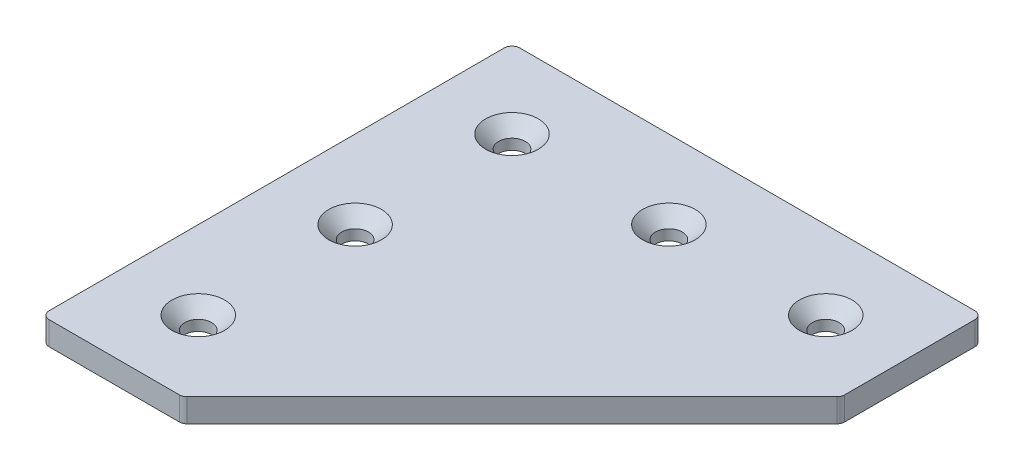
ISO-10303-21;
HEADER;
FILE_DESCRIPTION(('STEP AP214'),'2;1');
FILE_NAME('part.step','',(''),(''),'','','');
FILE_SCHEMA(('AUTOMOTIVE_DESIGN { 1 0 10303 214 1 1 1 1 }'));
ENDSEC;
DATA;
#1=APPLICATION_CONTEXT('core data for automotive mechanical design processes');
#2=APPLICATION_PROTOCOL_DEFINITION('international standard','automotive_design',2000,#1);
#3=PRODUCT_CONTEXT('',#1,'mechanical');
#4=PRODUCT('Part','Part','',(#3));
#5=PRODUCT_RELATED_PRODUCT_CATEGORY('part','',(#4));
#6=PRODUCT_DEFINITION_FORMATION('','',#4);
#7=PRODUCT_DEFINITION_CONTEXT('part definition',#1,'design');
#8=PRODUCT_DEFINITION('design','',#6,#7);
#9=PRODUCT_DEFINITION_SHAPE('','',#8);
#10=(LENGTH_UNIT() NAMED_UNIT(*) SI_UNIT(.MILLI.,.METRE.));
#11=(NAMED_UNIT(*) PLANE_ANGLE_UNIT() SI_UNIT($,.RADIAN.));
#12=(NAMED_UNIT(*) SI_UNIT($,.STERADIAN.) SOLID_ANGLE_UNIT());
#13=UNCERTAINTY_MEASURE_WITH_UNIT(LENGTH_MEASURE(1.E-05),#10,'distance_accuracy_value','');
#14=(GEOMETRIC_REPRESENTATION_CONTEXT(3) GLOBAL_UNCERTAINTY_ASSIGNED_CONTEXT((#13)) GLOBAL_UNIT_ASSIGNED_CONTEXT((#10,
#11,#12)) REPRESENTATION_CONTEXT('',''));
#15=CARTESIAN_POINT('',(0.,0.,0.));
#16=DIRECTION('',(0.,0.,1.));
#17=DIRECTION('',(1.,0.,0.));
#18=AXIS2_PLACEMENT_3D('',#15,#16,#17);
#19=CARTESIAN_POINT('',(30.,3.,30.));
#20=DIRECTION('',(-1.,0.,0.));
#21=DIRECTION('',(0.,0.,1.));
#22=AXIS2_PLACEMENT_3D('',#19,#20,#21);
#23=PLANE('',#22);
#24=DIRECTION('',(0.,0.,-1.));
#25=VECTOR('',#24,1.);
#26=CARTESIAN_POINT('',(30.,0.,30.));
#27=LINE('',#26,#25);
#28=CARTESIAN_POINT('',(30.,0.,-12.4142135623731));
#29=VERTEX_POINT('',#28);
#30=CARTESIAN_POINT('',(30.,0.,-29.));
#31=VERTEX_POINT('',#30);
#32=EDGE_CURVE('E143',#29,#31,#27,.T.);
#33=ORIENTED_EDGE('',*,*,#32,.T.);
#34=DIRECTION('',(0.,-1.,0.));
#35=VECTOR('',#34,1.);
#36=CARTESIAN_POINT('',(30.,3.,-29.));
#37=LINE('',#36,#35);
#38=CARTESIAN_POINT('',(30.,3.,-29.));
#39=VERTEX_POINT('',#38);
#40=EDGE_CURVE('E48',#31,#39,#37,.F.);
#41=ORIENTED_EDGE('',*,*,#40,.T.);
#42=DIRECTION('',(0.,0.,-1.));
#43=VECTOR('',#42,1.);
#44=CARTESIAN_POINT('',(30.,3.,30.));
#45=LINE('',#44,#43);
#46=CARTESIAN_POINT('',(30.,3.,-12.4142135623731));
#47=VERTEX_POINT('',#46);
#48=EDGE_CURVE('E141',#47,#39,#45,.T.);
#49=ORIENTED_EDGE('',*,*,#48,.F.);
#50=DIRECTION('',(0.,1.,0.));
#51=VECTOR('',#50,1.);
#52=CARTESIAN_POINT('',(30.,3.,-12.4142135623731));
#53=LINE('',#52,#51);
#54=EDGE_CURVE('E170',#47,#29,#53,.F.);
#55=ORIENTED_EDGE('',*,*,#54,.T.);
#56=EDGE_LOOP('',(#33,#41,#49,#55));
#57=FACE_BOUND('',#56,.T.);
#58=ADVANCED_FACE('F33',(#57),#23,.F.);
#59=CARTESIAN_POINT('',(-30.,3.,-30.));
#60=DIRECTION('',(0.,0.,1.));
#61=DIRECTION('',(1.,0.,0.));
#62=AXIS2_PLACEMENT_3D('',#59,#60,#61);
#63=PLANE('',#62);
#64=DIRECTION('',(-1.,0.,0.));
#65=VECTOR('',#64,1.);
#66=CARTESIAN_POINT('',(-30.,0.,-30.));
#67=LINE('',#66,#65);
#68=CARTESIAN_POINT('',(29.,0.,-30.));
#69=VERTEX_POINT('',#68);
#70=CARTESIAN_POINT('',(-29.,0.,-30.));
#71=VERTEX_POINT('',#70);
#72=EDGE_CURVE('E138',#69,#71,#67,.T.);
#73=ORIENTED_EDGE('',*,*,#72,.T.);
#74=DIRECTION('',(0.,-1.,0.));
#75=VECTOR('',#74,1.);
#76=CARTESIAN_POINT('',(-29.,3.,-30.));
#77=LINE('',#76,#75);
#78=CARTESIAN_POINT('',(-29.,3.,-30.));
#79=VERTEX_POINT('',#78);
#80=EDGE_CURVE('E116',#71,#79,#77,.F.);
#81=ORIENTED_EDGE('',*,*,#80,.T.);
#82=DIRECTION('',(-1.,0.,0.));
#83=VECTOR('',#82,1.);
#84=CARTESIAN_POINT('',(-30.,3.,-30.));
#85=LINE('',#84,#83);
#86=CARTESIAN_POINT('',(29.,3.,-30.));
#87=VERTEX_POINT('',#86);
#88=EDGE_CURVE('E195',#87,#79,#85,.T.);
#89=ORIENTED_EDGE('',*,*,#88,.F.);
#90=DIRECTION('',(0.,-1.,0.));
#91=VECTOR('',#90,1.);
#92=CARTESIAN_POINT('',(29.,3.,-30.));
#93=LINE('',#92,#91);
#94=EDGE_CURVE('E121',#87,#69,#93,.T.);
#95=ORIENTED_EDGE('',*,*,#94,.T.);
#96=EDGE_LOOP('',(#73,#81,#89,#95));
#97=FACE_BOUND('',#96,.T.);
#98=ADVANCED_FACE('F212',(#97),#63,.F.);
#99=CARTESIAN_POINT('',(-30.,3.,30.));
#100=DIRECTION('',(1.,0.,0.));
#101=DIRECTION('',(0.,0.,-1.));
#102=AXIS2_PLACEMENT_3D('',#99,#100,#101);
#103=PLANE('',#102);
#104=DIRECTION('',(0.,0.,1.));
#105=VECTOR('',#104,1.);
#106=CARTESIAN_POINT('',(-30.,3.,30.));
#107=LINE('',#106,#105);
#108=CARTESIAN_POINT('',(-30.,3.,-29.));
#109=VERTEX_POINT('',#108);
#110=CARTESIAN_POINT('',(-30.,3.,29.));
#111=VERTEX_POINT('',#110);
#112=EDGE_CURVE('E131',#109,#111,#107,.T.);
#113=ORIENTED_EDGE('',*,*,#112,.F.);
#114=DIRECTION('',(0.,-1.,0.));
#115=VECTOR('',#114,1.);
#116=CARTESIAN_POINT('',(-30.,3.,-29.));
#117=LINE('',#116,#115);
#118=CARTESIAN_POINT('',(-30.,0.,-29.));
#119=VERTEX_POINT('',#118);
#120=EDGE_CURVE('E115',#109,#119,#117,.T.);
#121=ORIENTED_EDGE('',*,*,#120,.T.);
#122=DIRECTION('',(0.,0.,1.));
#123=VECTOR('',#122,1.);
#124=CARTESIAN_POINT('',(-30.,0.,30.));
#125=LINE('',#124,#123);
#126=CARTESIAN_POINT('',(-30.,0.,29.));
#127=VERTEX_POINT('',#126);
#128=EDGE_CURVE('E128',#119,#127,#125,.T.);
#129=ORIENTED_EDGE('',*,*,#128,.T.);
#130=DIRECTION('',(0.,-1.,0.));
#131=VECTOR('',#130,1.);
#132=CARTESIAN_POINT('',(-30.,3.,29.));
#133=LINE('',#132,#131);
#134=EDGE_CURVE('E133',#127,#111,#133,.F.);
#135=ORIENTED_EDGE('',*,*,#134,.T.);
#136=EDGE_LOOP('',(#113,#121,#129,#135));
#137=FACE_BOUND('',#136,.T.);
#138=ADVANCED_FACE('F127',(#137),#103,.F.);
#139=CARTESIAN_POINT('',(-30.,3.,30.));
#140=DIRECTION('',(0.,0.,-1.));
#141=DIRECTION('',(-1.,0.,0.));
#142=AXIS2_PLACEMENT_3D('',#139,#140,#141);
#143=PLANE('',#142);
#144=DIRECTION('',(1.,0.,0.));
#145=VECTOR('',#144,1.);
#146=CARTESIAN_POINT('',(-30.,0.,30.));
#147=LINE('',#146,#145);
#148=CARTESIAN_POINT('',(-29.,0.,30.));
#149=VERTEX_POINT('',#148);
#150=CARTESIAN_POINT('',(-12.4142135623731,0.,30.));
#151=VERTEX_POINT('',#150);
#152=EDGE_CURVE('E137',#149,#151,#147,.T.);
#153=ORIENTED_EDGE('',*,*,#152,.T.);
#154=DIRECTION('',(0.,1.,0.));
#155=VECTOR('',#154,1.);
#156=CARTESIAN_POINT('',(-12.4142135623731,3.,30.));
#157=LINE('',#156,#155);
#158=CARTESIAN_POINT('',(-12.4142135623731,3.,30.));
#159=VERTEX_POINT('',#158);
#160=EDGE_CURVE('E11',#151,#159,#157,.T.);
#161=ORIENTED_EDGE('',*,*,#160,.T.);
#162=DIRECTION('',(1.,0.,0.));
#163=VECTOR('',#162,1.);
#164=CARTESIAN_POINT('',(-30.,3.,30.));
#165=LINE('',#164,#163);
#166=CARTESIAN_POINT('',(-29.,3.,30.));
#167=VERTEX_POINT('',#166);
#168=EDGE_CURVE('E150',#167,#159,#165,.T.);
#169=ORIENTED_EDGE('',*,*,#168,.F.);
#170=DIRECTION('',(0.,-1.,0.));
#171=VECTOR('',#170,1.);
#172=CARTESIAN_POINT('',(-29.,3.,30.));
#173=LINE('',#172,#171);
#174=EDGE_CURVE('E41',#167,#149,#173,.T.);
#175=ORIENTED_EDGE('',*,*,#174,.T.);
#176=EDGE_LOOP('',(#153,#161,#169,#175));
#177=FACE_BOUND('',#176,.T.);
#178=ADVANCED_FACE('F181',(#177),#143,.F.);
#179=CARTESIAN_POINT('',(0.,3.,0.));
#180=DIRECTION('',(0.,-1.,0.));
#181=DIRECTION('',(0.,0.,-1.));
#182=AXIS2_PLACEMENT_3D('',#179,#180,#181);
#183=PLANE('',#182);
#184=CARTESIAN_POINT('',(-20.,3.,-20.));
#185=DIRECTION('',(0.,1.,0.));
#186=DIRECTION('',(0.,0.,1.));
#187=AXIS2_PLACEMENT_3D('',#184,#185,#186);
#188=CIRCLE('',#187,3.36);
#189=CARTESIAN_POINT('',(-20.,3.,-16.64));
#190=VERTEX_POINT('',#189);
#191=EDGE_CURVE('E400',#190,#190,#188,.T.);
#192=ORIENTED_EDGE('',*,*,#191,.F.);
#193=EDGE_LOOP('',(#192));
#194=FACE_BOUND('',#193,.T.);
#195=CARTESIAN_POINT('',(0.,3.,-20.));
#196=DIRECTION('',(0.,1.,0.));
#197=DIRECTION('',(0.,0.,1.));
#198=AXIS2_PLACEMENT_3D('',#195,#196,#197);
#199=CIRCLE('',#198,3.36);
#200=CARTESIAN_POINT('',(0.,3.,-16.64));
#201=VERTEX_POINT('',#200);
#202=EDGE_CURVE('E404',#201,#201,#199,.T.);
#203=ORIENTED_EDGE('',*,*,#202,.F.);
#204=EDGE_LOOP('',(#203));
#205=FACE_BOUND('',#204,.T.);
#206=CARTESIAN_POINT('',(20.,3.,-20.));
#207=DIRECTION('',(0.,1.,0.));
#208=DIRECTION('',(0.,0.,1.));
#209=AXIS2_PLACEMENT_3D('',#206,#207,#208);
#210=CIRCLE('',#209,3.36);
#211=CARTESIAN_POINT('',(20.,3.,-16.64));
#212=VERTEX_POINT('',#211);
#213=EDGE_CURVE('E408',#212,#212,#210,.T.);
#214=ORIENTED_EDGE('',*,*,#213,.F.);
#215=EDGE_LOOP('',(#214));
#216=FACE_BOUND('',#215,.T.);
#217=CARTESIAN_POINT('',(-20.,3.,0.));
#218=DIRECTION('',(0.,1.,0.));
#219=DIRECTION('',(0.,0.,1.));
#220=AXIS2_PLACEMENT_3D('',#217,#218,#219);
#221=CIRCLE('',#220,3.36);
#222=CARTESIAN_POINT('',(-20.,3.,3.36));
#223=VERTEX_POINT('',#222);
#224=EDGE_CURVE('E412',#223,#223,#221,.T.);
#225=ORIENTED_EDGE('',*,*,#224,.F.);
#226=EDGE_LOOP('',(#225));
#227=FACE_BOUND('',#226,.T.);
#228=CARTESIAN_POINT('',(-20.,3.,20.));
#229=DIRECTION('',(0.,1.,0.));
#230=DIRECTION('',(0.,0.,1.));
#231=AXIS2_PLACEMENT_3D('',#228,#229,#230);
#232=CIRCLE('',#231,3.36);
#233=CARTESIAN_POINT('',(-20.,3.,23.36));
#234=VERTEX_POINT('',#233);
#235=EDGE_CURVE('E415',#234,#234,#232,.T.);
#236=ORIENTED_EDGE('',*,*,#235,.F.);
#237=EDGE_LOOP('',(#236));
#238=FACE_BOUND('',#237,.T.);
#239=ORIENTED_EDGE('',*,*,#88,.T.);
#240=CARTESIAN_POINT('',(-29.,3.,-29.));
#241=DIRECTION('',(0.,-1.,0.));
#242=DIRECTION('',(0.,0.,-1.));
#243=AXIS2_PLACEMENT_3D('',#240,#241,#242);
#244=CIRCLE('',#243,1.);
#245=EDGE_CURVE('E168',#79,#109,#244,.F.);
#246=ORIENTED_EDGE('',*,*,#245,.T.);
#247=ORIENTED_EDGE('',*,*,#112,.T.);
#248=CARTESIAN_POINT('',(-29.,3.,29.));
#249=DIRECTION('',(0.,-1.,0.));
#250=DIRECTION('',(0.,0.,-1.));
#251=AXIS2_PLACEMENT_3D('',#248,#249,#250);
#252=CIRCLE('',#251,1.);
#253=EDGE_CURVE('E161',#111,#167,#252,.F.);
#254=ORIENTED_EDGE('',*,*,#253,.T.);
#255=ORIENTED_EDGE('',*,*,#168,.T.);
#256=CARTESIAN_POINT('',(-12.4142135623731,3.,29.));
#257=DIRECTION('',(0.,-1.,0.));
#258=DIRECTION('',(0.,0.,-1.));
#259=AXIS2_PLACEMENT_3D('',#256,#257,#258);
#260=CIRCLE('',#259,1.);
#261=CARTESIAN_POINT('',(-11.7071067811865,3.,29.7071067811865));
#262=VERTEX_POINT('',#261);
#263=EDGE_CURVE('E163',#159,#262,#260,.F.);
#264=ORIENTED_EDGE('',*,*,#263,.T.);
#265=DIRECTION('',(-0.707106781186547,0.,0.707106781186547));
#266=VECTOR('',#265,1.);
#267=CARTESIAN_POINT('',(30.,3.,-12.));
#268=LINE('',#267,#266);
#269=CARTESIAN_POINT('',(29.7071067811865,3.,-11.7071067811865));
#270=VERTEX_POINT('',#269);
#271=EDGE_CURVE('E198',#270,#262,#268,.T.);
#272=ORIENTED_EDGE('',*,*,#271,.F.);
#273=CARTESIAN_POINT('',(29.,3.,-12.4142135623731));
#274=DIRECTION('',(0.,-1.,0.));
#275=DIRECTION('',(0.,0.,-1.));
#276=AXIS2_PLACEMENT_3D('',#273,#274,#275);
#277=CIRCLE('',#276,1.);
#278=EDGE_CURVE('E55',#270,#47,#277,.F.);
#279=ORIENTED_EDGE('',*,*,#278,.T.);
#280=ORIENTED_EDGE('',*,*,#48,.T.);
#281=CARTESIAN_POINT('',(29.,3.,-29.));
#282=DIRECTION('',(0.,-1.,0.));
#283=DIRECTION('',(0.,0.,-1.));
#284=AXIS2_PLACEMENT_3D('',#281,#282,#283);
#285=CIRCLE('',#284,1.);
#286=EDGE_CURVE('E166',#39,#87,#285,.F.);
#287=ORIENTED_EDGE('',*,*,#286,.T.);
#288=EDGE_LOOP('',(#239,#246,#247,#254,#255,#264,#272,#279,#280,#287));
#289=FACE_BOUND('',#288,.T.);
#290=ADVANCED_FACE('F192',(#194,#205,#216,#227,#238,#289),#183,.F.);
#291=CARTESIAN_POINT('',(0.,0.,0.));
#292=DIRECTION('',(0.,-1.,0.));
#293=DIRECTION('',(0.,0.,-1.));
#294=AXIS2_PLACEMENT_3D('',#291,#292,#293);
#295=PLANE('',#294);
#296=CARTESIAN_POINT('',(-20.,0.,-20.));
#297=DIRECTION('',(0.,1.,0.));
#298=DIRECTION('',(0.,0.,1.));
#299=AXIS2_PLACEMENT_3D('',#296,#297,#298);
#300=CIRCLE('',#299,1.7);
#301=CARTESIAN_POINT('',(-20.,0.,-18.3));
#302=VERTEX_POINT('',#301);
#303=EDGE_CURVE('E441',#302,#302,#300,.T.);
#304=ORIENTED_EDGE('',*,*,#303,.T.);
#305=EDGE_LOOP('',(#304));
#306=FACE_BOUND('',#305,.T.);
#307=CARTESIAN_POINT('',(0.,0.,-20.));
#308=DIRECTION('',(0.,1.,0.));
#309=DIRECTION('',(0.,0.,1.));
#310=AXIS2_PLACEMENT_3D('',#307,#308,#309);
#311=CIRCLE('',#310,1.7);
#312=CARTESIAN_POINT('',(0.,0.,-18.3));
#313=VERTEX_POINT('',#312);
#314=EDGE_CURVE('E434',#313,#313,#311,.T.);
#315=ORIENTED_EDGE('',*,*,#314,.T.);
#316=EDGE_LOOP('',(#315));
#317=FACE_BOUND('',#316,.T.);
#318=CARTESIAN_POINT('',(20.,0.,-20.));
#319=DIRECTION('',(0.,1.,0.));
#320=DIRECTION('',(0.,0.,1.));
#321=AXIS2_PLACEMENT_3D('',#318,#319,#320);
#322=CIRCLE('',#321,1.7);
#323=CARTESIAN_POINT('',(20.,0.,-18.3));
#324=VERTEX_POINT('',#323);
#325=EDGE_CURVE('E427',#324,#324,#322,.T.);
#326=ORIENTED_EDGE('',*,*,#325,.T.);
#327=EDGE_LOOP('',(#326));
#328=FACE_BOUND('',#327,.T.);
#329=CARTESIAN_POINT('',(-20.,0.,0.));
#330=DIRECTION('',(0.,1.,0.));
#331=DIRECTION('',(0.,0.,1.));
#332=AXIS2_PLACEMENT_3D('',#329,#330,#331);
#333=CIRCLE('',#332,1.7);
#334=CARTESIAN_POINT('',(-20.,0.,1.7));
#335=VERTEX_POINT('',#334);
#336=EDGE_CURVE('E417',#335,#335,#333,.T.);
#337=ORIENTED_EDGE('',*,*,#336,.T.);
#338=EDGE_LOOP('',(#337));
#339=FACE_BOUND('',#338,.T.);
#340=CARTESIAN_POINT('',(-20.,0.,20.));
#341=DIRECTION('',(0.,1.,0.));
#342=DIRECTION('',(0.,0.,1.));
#343=AXIS2_PLACEMENT_3D('',#340,#341,#342);
#344=CIRCLE('',#343,1.7);
#345=CARTESIAN_POINT('',(-20.,0.,21.7));
#346=VERTEX_POINT('',#345);
#347=EDGE_CURVE('E200',#346,#346,#344,.T.);
#348=ORIENTED_EDGE('',*,*,#347,.T.);
#349=EDGE_LOOP('',(#348));
#350=FACE_BOUND('',#349,.T.);
#351=ORIENTED_EDGE('',*,*,#128,.F.);
#352=CARTESIAN_POINT('',(-29.,0.,-29.));
#353=DIRECTION('',(0.,-1.,0.));
#354=DIRECTION('',(0.,0.,-1.));
#355=AXIS2_PLACEMENT_3D('',#352,#353,#354);
#356=CIRCLE('',#355,1.);
#357=EDGE_CURVE('E111',#119,#71,#356,.T.);
#358=ORIENTED_EDGE('',*,*,#357,.T.);
#359=ORIENTED_EDGE('',*,*,#72,.F.);
#360=CARTESIAN_POINT('',(29.,0.,-29.));
#361=DIRECTION('',(0.,-1.,0.));
#362=DIRECTION('',(0.,0.,-1.));
#363=AXIS2_PLACEMENT_3D('',#360,#361,#362);
#364=CIRCLE('',#363,1.);
#365=EDGE_CURVE('E122',#69,#31,#364,.T.);
#366=ORIENTED_EDGE('',*,*,#365,.T.);
#367=ORIENTED_EDGE('',*,*,#32,.F.);
#368=CARTESIAN_POINT('',(29.,0.,-12.4142135623731));
#369=DIRECTION('',(0.,-1.,0.));
#370=DIRECTION('',(0.,0.,-1.));
#371=AXIS2_PLACEMENT_3D('',#368,#369,#370);
#372=CIRCLE('',#371,1.);
#373=CARTESIAN_POINT('',(29.7071067811865,0.,-11.7071067811866));
#374=VERTEX_POINT('',#373);
#375=EDGE_CURVE('E155',#29,#374,#372,.T.);
#376=ORIENTED_EDGE('',*,*,#375,.T.);
#377=DIRECTION('',(0.707106781186548,0.,-0.707106781186548));
#378=VECTOR('',#377,1.);
#379=CARTESIAN_POINT('',(9.,0.,9.));
#380=LINE('',#379,#378);
#381=CARTESIAN_POINT('',(-11.7071067811866,0.,29.7071067811865));
#382=VERTEX_POINT('',#381);
#383=EDGE_CURVE('E147',#382,#374,#380,.T.);
#384=ORIENTED_EDGE('',*,*,#383,.F.);
#385=CARTESIAN_POINT('',(-12.4142135623731,0.,29.));
#386=DIRECTION('',(0.,-1.,0.));
#387=DIRECTION('',(0.,0.,-1.));
#388=AXIS2_PLACEMENT_3D('',#385,#386,#387);
#389=CIRCLE('',#388,1.);
#390=EDGE_CURVE('E153',#382,#151,#389,.T.);
#391=ORIENTED_EDGE('',*,*,#390,.T.);
#392=ORIENTED_EDGE('',*,*,#152,.F.);
#393=CARTESIAN_POINT('',(-29.,0.,29.));
#394=DIRECTION('',(0.,-1.,0.));
#395=DIRECTION('',(0.,0.,-1.));
#396=AXIS2_PLACEMENT_3D('',#393,#394,#395);
#397=CIRCLE('',#396,1.);
#398=EDGE_CURVE('E132',#149,#127,#397,.T.);
#399=ORIENTED_EDGE('',*,*,#398,.T.);
#400=EDGE_LOOP('',(#351,#358,#359,#366,#367,#376,#384,#391,#392,#399));
#401=FACE_BOUND('',#400,.T.);
#402=ADVANCED_FACE('F135',(#306,#317,#328,#339,#350,#401),#295,.T.);
#403=CARTESIAN_POINT('',(30.,-7.,-12.));
#404=DIRECTION('',(-0.707106781186548,0.,-0.707106781186548));
#405=DIRECTION('',(-0.707106781186548,0.,0.707106781186548));
#406=AXIS2_PLACEMENT_3D('',#403,#404,#405);
#407=PLANE('',#406);
#408=ORIENTED_EDGE('',*,*,#383,.T.);
#409=DIRECTION('',(0.,1.,0.));
#410=VECTOR('',#409,1.);
#411=CARTESIAN_POINT('',(29.7071067811865,-7.,-11.7071067811865));
#412=LINE('',#411,#410);
#413=EDGE_CURVE('E175',#374,#270,#412,.T.);
#414=ORIENTED_EDGE('',*,*,#413,.T.);
#415=ORIENTED_EDGE('',*,*,#271,.T.);
#416=DIRECTION('',(0.,1.,0.));
#417=VECTOR('',#416,1.);
#418=CARTESIAN_POINT('',(-11.7071067811865,-7.,29.7071067811865));
#419=LINE('',#418,#417);
#420=EDGE_CURVE('E173',#262,#382,#419,.F.);
#421=ORIENTED_EDGE('',*,*,#420,.T.);
#422=EDGE_LOOP('',(#408,#414,#415,#421));
#423=FACE_BOUND('',#422,.T.);
#424=ADVANCED_FACE('F220',(#423),#407,.F.);
#425=CARTESIAN_POINT('',(-20.,3.,20.));
#426=DIRECTION('',(0.,1.,0.));
#427=DIRECTION('',(0.,0.,1.));
#428=AXIS2_PLACEMENT_3D('',#425,#426,#427);
#429=CYLINDRICAL_SURFACE('',#428,1.7);
#430=ORIENTED_EDGE('',*,*,#347,.F.);
#431=EDGE_LOOP('',(#430));
#432=FACE_BOUND('',#431,.T.);
#433=CARTESIAN_POINT('',(-20.,1.34,20.));
#434=DIRECTION('',(0.,1.,0.));
#435=DIRECTION('',(0.,0.,1.));
#436=AXIS2_PLACEMENT_3D('',#433,#434,#435);
#437=CIRCLE('',#436,1.7);
#438=CARTESIAN_POINT('',(-20.,1.34,21.7));
#439=VERTEX_POINT('',#438);
#440=EDGE_CURVE('E204',#439,#439,#437,.T.);
#441=ORIENTED_EDGE('',*,*,#440,.T.);
#442=EDGE_LOOP('',(#441));
#443=FACE_BOUND('',#442,.T.);
#444=ADVANCED_FACE('F222',(#432,#443),#429,.F.);
#445=CARTESIAN_POINT('',(-20.,3.,20.));
#446=DIRECTION('',(0.,1.,0.));
#447=DIRECTION('',(0.,0.,1.));
#448=AXIS2_PLACEMENT_3D('',#445,#446,#447);
#449=CONICAL_SURFACE('',#448,3.36,0.785398163397449);
#450=ORIENTED_EDGE('',*,*,#440,.F.);
#451=EDGE_LOOP('',(#450));
#452=FACE_BOUND('',#451,.T.);
#453=ORIENTED_EDGE('',*,*,#235,.T.);
#454=EDGE_LOOP('',(#453));
#455=FACE_BOUND('',#454,.T.);
#456=ADVANCED_FACE('F229',(#452,#455),#449,.F.);
#457=CARTESIAN_POINT('',(-20.,3.,0.));
#458=DIRECTION('',(0.,1.,0.));
#459=DIRECTION('',(0.,0.,1.));
#460=AXIS2_PLACEMENT_3D('',#457,#458,#459);
#461=CYLINDRICAL_SURFACE('',#460,1.7);
#462=ORIENTED_EDGE('',*,*,#336,.F.);
#463=EDGE_LOOP('',(#462));
#464=FACE_BOUND('',#463,.T.);
#465=CARTESIAN_POINT('',(-20.,1.34,0.));
#466=DIRECTION('',(0.,1.,0.));
#467=DIRECTION('',(0.,0.,1.));
#468=AXIS2_PLACEMENT_3D('',#465,#466,#467);
#469=CIRCLE('',#468,1.7);
#470=CARTESIAN_POINT('',(-20.,1.34,1.7));
#471=VERTEX_POINT('',#470);
#472=EDGE_CURVE('E421',#471,#471,#469,.T.);
#473=ORIENTED_EDGE('',*,*,#472,.T.);
#474=EDGE_LOOP('',(#473));
#475=FACE_BOUND('',#474,.T.);
#476=ADVANCED_FACE('F332',(#464,#475),#461,.F.);
#477=CARTESIAN_POINT('',(-20.,3.,0.));
#478=DIRECTION('',(0.,1.,0.));
#479=DIRECTION('',(0.,0.,1.));
#480=AXIS2_PLACEMENT_3D('',#477,#478,#479);
#481=CONICAL_SURFACE('',#480,3.36,0.785398163397449);
#482=ORIENTED_EDGE('',*,*,#472,.F.);
#483=EDGE_LOOP('',(#482));
#484=FACE_BOUND('',#483,.T.);
#485=ORIENTED_EDGE('',*,*,#224,.T.);
#486=EDGE_LOOP('',(#485));
#487=FACE_BOUND('',#486,.T.);
#488=ADVANCED_FACE('F324',(#484,#487),#481,.F.);
#489=CARTESIAN_POINT('',(20.,3.,-20.));
#490=DIRECTION('',(0.,1.,0.));
#491=DIRECTION('',(0.,0.,1.));
#492=AXIS2_PLACEMENT_3D('',#489,#490,#491);
#493=CYLINDRICAL_SURFACE('',#492,1.7);
#494=ORIENTED_EDGE('',*,*,#325,.F.);
#495=EDGE_LOOP('',(#494));
#496=FACE_BOUND('',#495,.T.);
#497=CARTESIAN_POINT('',(20.,1.34,-20.));
#498=DIRECTION('',(0.,1.,0.));
#499=DIRECTION('',(0.,0.,1.));
#500=AXIS2_PLACEMENT_3D('',#497,#498,#499);
#501=CIRCLE('',#500,1.7);
#502=CARTESIAN_POINT('',(20.,1.34,-18.3));
#503=VERTEX_POINT('',#502);
#504=EDGE_CURVE('E430',#503,#503,#501,.T.);
#505=ORIENTED_EDGE('',*,*,#504,.T.);
#506=EDGE_LOOP('',(#505));
#507=FACE_BOUND('',#506,.T.);
#508=ADVANCED_FACE('F316',(#496,#507),#493,.F.);
#509=CARTESIAN_POINT('',(20.,3.,-20.));
#510=DIRECTION('',(0.,1.,0.));
#511=DIRECTION('',(0.,0.,1.));
#512=AXIS2_PLACEMENT_3D('',#509,#510,#511);
#513=CONICAL_SURFACE('',#512,3.36,0.785398163397449);
#514=ORIENTED_EDGE('',*,*,#504,.F.);
#515=EDGE_LOOP('',(#514));
#516=FACE_BOUND('',#515,.T.);
#517=ORIENTED_EDGE('',*,*,#213,.T.);
#518=EDGE_LOOP('',(#517));
#519=FACE_BOUND('',#518,.T.);
#520=ADVANCED_FACE('F308',(#516,#519),#513,.F.);
#521=CARTESIAN_POINT('',(0.,3.,-20.));
#522=DIRECTION('',(0.,1.,0.));
#523=DIRECTION('',(0.,0.,1.));
#524=AXIS2_PLACEMENT_3D('',#521,#522,#523);
#525=CYLINDRICAL_SURFACE('',#524,1.7);
#526=ORIENTED_EDGE('',*,*,#314,.F.);
#527=EDGE_LOOP('',(#526));
#528=FACE_BOUND('',#527,.T.);
#529=CARTESIAN_POINT('',(0.,1.34,-20.));
#530=DIRECTION('',(0.,1.,0.));
#531=DIRECTION('',(0.,0.,1.));
#532=AXIS2_PLACEMENT_3D('',#529,#530,#531);
#533=CIRCLE('',#532,1.7);
#534=CARTESIAN_POINT('',(0.,1.34,-18.3));
#535=VERTEX_POINT('',#534);
#536=EDGE_CURVE('E437',#535,#535,#533,.T.);
#537=ORIENTED_EDGE('',*,*,#536,.T.);
#538=EDGE_LOOP('',(#537));
#539=FACE_BOUND('',#538,.T.);
#540=ADVANCED_FACE('F300',(#528,#539),#525,.F.);
#541=CARTESIAN_POINT('',(0.,3.,-20.));
#542=DIRECTION('',(0.,1.,0.));
#543=DIRECTION('',(0.,0.,1.));
#544=AXIS2_PLACEMENT_3D('',#541,#542,#543);
#545=CONICAL_SURFACE('',#544,3.36,0.785398163397449);
#546=ORIENTED_EDGE('',*,*,#536,.F.);
#547=EDGE_LOOP('',(#546));
#548=FACE_BOUND('',#547,.T.);
#549=ORIENTED_EDGE('',*,*,#202,.T.);
#550=EDGE_LOOP('',(#549));
#551=FACE_BOUND('',#550,.T.);
#552=ADVANCED_FACE('F292',(#548,#551),#545,.F.);
#553=CARTESIAN_POINT('',(-20.,3.,-20.));
#554=DIRECTION('',(0.,1.,0.));
#555=DIRECTION('',(0.,0.,1.));
#556=AXIS2_PLACEMENT_3D('',#553,#554,#555);
#557=CYLINDRICAL_SURFACE('',#556,1.7);
#558=ORIENTED_EDGE('',*,*,#303,.F.);
#559=EDGE_LOOP('',(#558));
#560=FACE_BOUND('',#559,.T.);
#561=CARTESIAN_POINT('',(-20.,1.34,-20.));
#562=DIRECTION('',(0.,1.,0.));
#563=DIRECTION('',(0.,0.,1.));
#564=AXIS2_PLACEMENT_3D('',#561,#562,#563);
#565=CIRCLE('',#564,1.7);
#566=CARTESIAN_POINT('',(-20.,1.34,-18.3));
#567=VERTEX_POINT('',#566);
#568=EDGE_CURVE('E444',#567,#567,#565,.T.);
#569=ORIENTED_EDGE('',*,*,#568,.T.);
#570=EDGE_LOOP('',(#569));
#571=FACE_BOUND('',#570,.T.);
#572=ADVANCED_FACE('F285',(#560,#571),#557,.F.);
#573=CARTESIAN_POINT('',(-20.,3.,-20.));
#574=DIRECTION('',(0.,1.,0.));
#575=DIRECTION('',(0.,0.,1.));
#576=AXIS2_PLACEMENT_3D('',#573,#574,#575);
#577=CONICAL_SURFACE('',#576,3.36,0.785398163397449);
#578=ORIENTED_EDGE('',*,*,#568,.F.);
#579=EDGE_LOOP('',(#578));
#580=FACE_BOUND('',#579,.T.);
#581=ORIENTED_EDGE('',*,*,#191,.T.);
#582=EDGE_LOOP('',(#581));
#583=FACE_BOUND('',#582,.T.);
#584=ADVANCED_FACE('F246',(#580,#583),#577,.F.);
#585=CARTESIAN_POINT('',(-29.,3.,-29.));
#586=DIRECTION('',(0.,-1.,0.));
#587=DIRECTION('',(0.,0.,-1.));
#588=AXIS2_PLACEMENT_3D('',#585,#586,#587);
#589=CYLINDRICAL_SURFACE('',#588,1.);
#590=ORIENTED_EDGE('',*,*,#245,.F.);
#591=ORIENTED_EDGE('',*,*,#80,.F.);
#592=ORIENTED_EDGE('',*,*,#357,.F.);
#593=ORIENTED_EDGE('',*,*,#120,.F.);
#594=EDGE_LOOP('',(#590,#591,#592,#593));
#595=FACE_BOUND('',#594,.T.);
#596=ADVANCED_FACE('F114',(#595),#589,.T.);
#597=CARTESIAN_POINT('',(29.,3.,-29.));
#598=DIRECTION('',(0.,-1.,0.));
#599=DIRECTION('',(0.,0.,-1.));
#600=AXIS2_PLACEMENT_3D('',#597,#598,#599);
#601=CYLINDRICAL_SURFACE('',#600,1.);
#602=ORIENTED_EDGE('',*,*,#286,.F.);
#603=ORIENTED_EDGE('',*,*,#40,.F.);
#604=ORIENTED_EDGE('',*,*,#365,.F.);
#605=ORIENTED_EDGE('',*,*,#94,.F.);
#606=EDGE_LOOP('',(#602,#603,#604,#605));
#607=FACE_BOUND('',#606,.T.);
#608=ADVANCED_FACE('F214',(#607),#601,.T.);
#609=CARTESIAN_POINT('',(29.,-7.,-12.4142135623731));
#610=DIRECTION('',(0.,1.,0.));
#611=DIRECTION('',(0.,0.,1.));
#612=AXIS2_PLACEMENT_3D('',#609,#610,#611);
#613=CYLINDRICAL_SURFACE('',#612,1.);
#614=ORIENTED_EDGE('',*,*,#375,.F.);
#615=ORIENTED_EDGE('',*,*,#54,.F.);
#616=ORIENTED_EDGE('',*,*,#278,.F.);
#617=ORIENTED_EDGE('',*,*,#413,.F.);
#618=EDGE_LOOP('',(#614,#615,#616,#617));
#619=FACE_BOUND('',#618,.T.);
#620=ADVANCED_FACE('F219',(#619),#613,.T.);
#621=CARTESIAN_POINT('',(-12.4142135623731,3.,29.));
#622=DIRECTION('',(0.,1.,0.));
#623=DIRECTION('',(0.,0.,1.));
#624=AXIS2_PLACEMENT_3D('',#621,#622,#623);
#625=CYLINDRICAL_SURFACE('',#624,1.);
#626=ORIENTED_EDGE('',*,*,#390,.F.);
#627=ORIENTED_EDGE('',*,*,#420,.F.);
#628=ORIENTED_EDGE('',*,*,#263,.F.);
#629=ORIENTED_EDGE('',*,*,#160,.F.);
#630=EDGE_LOOP('',(#626,#627,#628,#629));
#631=FACE_BOUND('',#630,.T.);
#632=ADVANCED_FACE('F190',(#631),#625,.T.);
#633=CARTESIAN_POINT('',(-29.,3.,29.));
#634=DIRECTION('',(0.,-1.,0.));
#635=DIRECTION('',(0.,0.,-1.));
#636=AXIS2_PLACEMENT_3D('',#633,#634,#635);
#637=CYLINDRICAL_SURFACE('',#636,1.);
#638=ORIENTED_EDGE('',*,*,#253,.F.);
#639=ORIENTED_EDGE('',*,*,#134,.F.);
#640=ORIENTED_EDGE('',*,*,#398,.F.);
#641=ORIENTED_EDGE('',*,*,#174,.F.);
#642=EDGE_LOOP('',(#638,#639,#640,#641));
#643=FACE_BOUND('',#642,.T.);
#644=ADVANCED_FACE('F35',(#643),#637,.T.);
#645=CLOSED_SHELL('',(#58,#98,#138,#178,#290,#402,#424,#444,#456,#476,#488,#508,#520,#540,#552,
#572,#584,#596,#608,#620,#632,#644));
#646=MANIFOLD_SOLID_BREP('B2',#645);
#647=ADVANCED_BREP_SHAPE_REPRESENTATION('',(#18,#646),#14);
#648=SHAPE_DEFINITION_REPRESENTATION(#9,#647);
ENDSEC;
END-ISO-10303-21;
